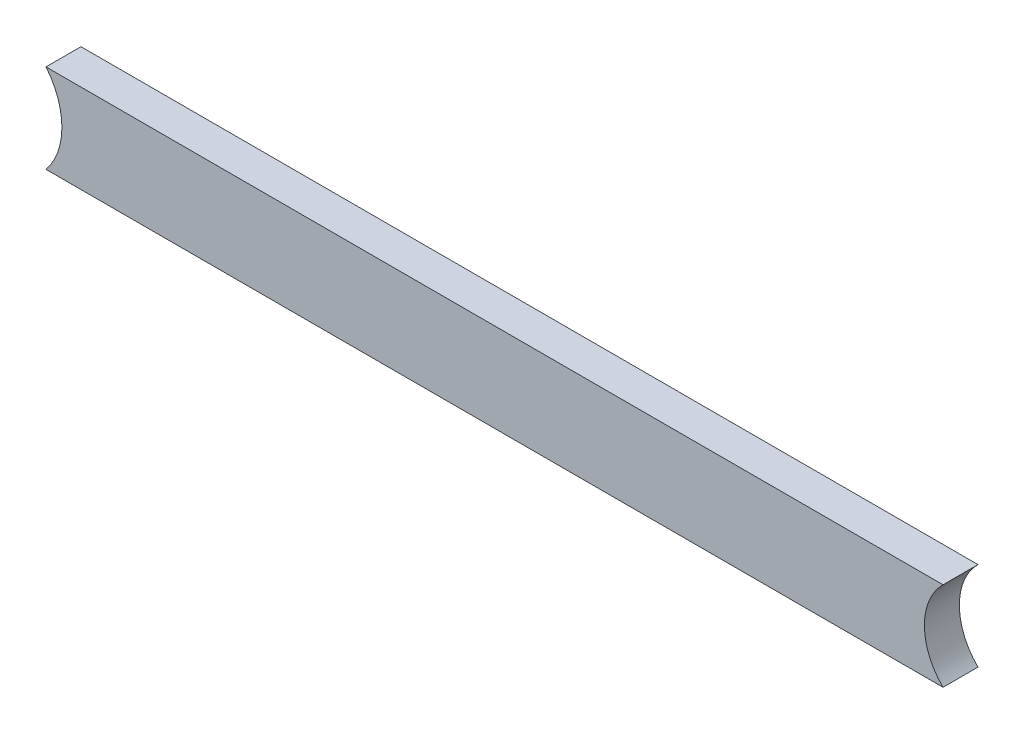
ISO-10303-21;
HEADER;
FILE_DESCRIPTION(('STEP AP214'),'2;1');
FILE_NAME('part.step','',(''),(''),'','','');
FILE_SCHEMA(('AUTOMOTIVE_DESIGN { 1 0 10303 214 1 1 1 1 }'));
ENDSEC;
DATA;
#1=APPLICATION_CONTEXT('core data for automotive mechanical design processes');
#2=APPLICATION_PROTOCOL_DEFINITION('international standard','automotive_design',2000,#1);
#3=PRODUCT_CONTEXT('',#1,'mechanical');
#4=PRODUCT('Part','Part','',(#3));
#5=PRODUCT_RELATED_PRODUCT_CATEGORY('part','',(#4));
#6=PRODUCT_DEFINITION_FORMATION('','',#4);
#7=PRODUCT_DEFINITION_CONTEXT('part definition',#1,'design');
#8=PRODUCT_DEFINITION('design','',#6,#7);
#9=PRODUCT_DEFINITION_SHAPE('','',#8);
#10=(LENGTH_UNIT() NAMED_UNIT(*) SI_UNIT(.MILLI.,.METRE.));
#11=(NAMED_UNIT(*) PLANE_ANGLE_UNIT() SI_UNIT($,.RADIAN.));
#12=(NAMED_UNIT(*) SI_UNIT($,.STERADIAN.) SOLID_ANGLE_UNIT());
#13=UNCERTAINTY_MEASURE_WITH_UNIT(LENGTH_MEASURE(1.E-05),#10,'distance_accuracy_value','');
#14=(GEOMETRIC_REPRESENTATION_CONTEXT(3) GLOBAL_UNCERTAINTY_ASSIGNED_CONTEXT((#13)) GLOBAL_UNIT_ASSIGNED_CONTEXT((#10,
#11,#12)) REPRESENTATION_CONTEXT('',''));
#15=CARTESIAN_POINT('',(0.,0.,0.));
#16=DIRECTION('',(0.,0.,1.));
#17=DIRECTION('',(1.,0.,0.));
#18=AXIS2_PLACEMENT_3D('',#15,#16,#17);
#19=CARTESIAN_POINT('',(112.831003818748,70.104,0.));
#20=DIRECTION('',(0.,1.,0.));
#21=DIRECTION('',(1.,0.,0.));
#22=AXIS2_PLACEMENT_3D('',#19,#20,#21);
#23=PLANE('',#22);
#24=DIRECTION('',(1.,0.,0.));
#25=VECTOR('',#24,1.);
#26=CARTESIAN_POINT('',(112.522,70.104,0.1999996));
#27=LINE('',#26,#25);
#28=CARTESIAN_POINT('',(112.831003818748,70.104,0.1999996));
#29=VERTEX_POINT('',#28);
#30=CARTESIAN_POINT('',(117.962731842133,70.104,0.1999996));
#31=VERTEX_POINT('',#30);
#32=EDGE_CURVE('E11',#29,#31,#27,.T.);
#33=ORIENTED_EDGE('',*,*,#32,.F.);
#34=DIRECTION('',(0.,0.,1.));
#35=VECTOR('',#34,1.);
#36=CARTESIAN_POINT('',(112.831003818748,70.104,0.));
#37=LINE('',#36,#35);
#38=CARTESIAN_POINT('',(112.831003818748,70.104,0.));
#39=VERTEX_POINT('',#38);
#40=EDGE_CURVE('E24',#39,#29,#37,.T.);
#41=ORIENTED_EDGE('',*,*,#40,.F.);
#42=DIRECTION('',(1.,0.,0.));
#43=VECTOR('',#42,1.);
#44=CARTESIAN_POINT('',(112.522,70.104,0.));
#45=LINE('',#44,#43);
#46=CARTESIAN_POINT('',(117.962731842133,70.104,0.));
#47=VERTEX_POINT('',#46);
#48=EDGE_CURVE('E82',#39,#47,#45,.T.);
#49=ORIENTED_EDGE('',*,*,#48,.T.);
#50=DIRECTION('',(0.,0.,1.));
#51=VECTOR('',#50,1.);
#52=CARTESIAN_POINT('',(117.962731842133,70.104,0.));
#53=LINE('',#52,#51);
#54=EDGE_CURVE('E37',#47,#31,#53,.T.);
#55=ORIENTED_EDGE('',*,*,#54,.T.);
#56=EDGE_LOOP('',(#33,#41,#49,#55));
#57=FACE_BOUND('',#56,.T.);
#58=ADVANCED_FACE('F17',(#57),#23,.F.);
#59=CARTESIAN_POINT('',(118.2116,70.358,0.));
#60=DIRECTION('',(0.,0.,-1.));
#61=DIRECTION('',(1.,0.,0.));
#62=AXIS2_PLACEMENT_3D('',#59,#60,#61);
#63=CYLINDRICAL_SURFACE('',#62,0.3556);
#64=DIRECTION('',(0.,0.,1.));
#65=VECTOR('',#64,1.);
#66=CARTESIAN_POINT('',(117.962731842133,70.612,0.));
#67=LINE('',#66,#65);
#68=CARTESIAN_POINT('',(117.962731842133,70.612,0.));
#69=VERTEX_POINT('',#68);
#70=CARTESIAN_POINT('',(117.962731842133,70.612,0.1999996));
#71=VERTEX_POINT('',#70);
#72=EDGE_CURVE('E97',#69,#71,#67,.T.);
#73=ORIENTED_EDGE('',*,*,#72,.T.);
#74=CARTESIAN_POINT('',(118.2116,70.358,0.1999996));
#75=DIRECTION('',(0.,0.,1.));
#76=DIRECTION('',(1.,0.,0.));
#77=AXIS2_PLACEMENT_3D('',#74,#75,#76);
#78=CIRCLE('',#77,0.3556);
#79=EDGE_CURVE('E94',#71,#31,#78,.T.);
#80=ORIENTED_EDGE('',*,*,#79,.T.);
#81=ORIENTED_EDGE('',*,*,#54,.F.);
#82=CARTESIAN_POINT('',(118.2116,70.358,0.));
#83=DIRECTION('',(0.,0.,1.));
#84=DIRECTION('',(1.,0.,0.));
#85=AXIS2_PLACEMENT_3D('',#82,#83,#84);
#86=CIRCLE('',#85,0.3556);
#87=EDGE_CURVE('E92',#69,#47,#86,.T.);
#88=ORIENTED_EDGE('',*,*,#87,.F.);
#89=EDGE_LOOP('',(#73,#80,#81,#88));
#90=FACE_BOUND('',#89,.T.);
#91=ADVANCED_FACE('F102',(#90),#63,.F.);
#92=CARTESIAN_POINT('',(117.962731842133,70.612,0.));
#93=DIRECTION('',(0.,-1.,0.));
#94=DIRECTION('',(-1.,0.,0.));
#95=AXIS2_PLACEMENT_3D('',#92,#93,#94);
#96=PLANE('',#95);
#97=DIRECTION('',(-1.,0.,0.));
#98=VECTOR('',#97,1.);
#99=CARTESIAN_POINT('',(118.2116,70.612,0.1999996));
#100=LINE('',#99,#98);
#101=CARTESIAN_POINT('',(112.831003818748,70.612,0.1999996));
#102=VERTEX_POINT('',#101);
#103=EDGE_CURVE('E89',#71,#102,#100,.T.);
#104=ORIENTED_EDGE('',*,*,#103,.F.);
#105=ORIENTED_EDGE('',*,*,#72,.F.);
#106=DIRECTION('',(-1.,0.,0.));
#107=VECTOR('',#106,1.);
#108=CARTESIAN_POINT('',(118.2116,70.612,0.));
#109=LINE('',#108,#107);
#110=CARTESIAN_POINT('',(112.831003818748,70.612,0.));
#111=VERTEX_POINT('',#110);
#112=EDGE_CURVE('E87',#69,#111,#109,.T.);
#113=ORIENTED_EDGE('',*,*,#112,.T.);
#114=DIRECTION('',(0.,0.,1.));
#115=VECTOR('',#114,1.);
#116=CARTESIAN_POINT('',(112.831003818748,70.612,0.));
#117=LINE('',#116,#115);
#118=EDGE_CURVE('E69',#111,#102,#117,.T.);
#119=ORIENTED_EDGE('',*,*,#118,.T.);
#120=EDGE_LOOP('',(#104,#105,#113,#119));
#121=FACE_BOUND('',#120,.T.);
#122=ADVANCED_FACE('F108',(#121),#96,.F.);
#123=CARTESIAN_POINT('',(112.522,70.358,0.));
#124=DIRECTION('',(0.,0.,-1.));
#125=DIRECTION('',(1.,0.,0.));
#126=AXIS2_PLACEMENT_3D('',#123,#124,#125);
#127=CYLINDRICAL_SURFACE('',#126,0.3999992);
#128=DIRECTION('',(0.,0.,1.));
#129=VECTOR('',#128,1.);
#130=CARTESIAN_POINT('',(112.9219992,70.358,0.));
#131=LINE('',#130,#129);
#132=CARTESIAN_POINT('',(112.9219992,70.358,0.));
#133=VERTEX_POINT('',#132);
#134=CARTESIAN_POINT('',(112.9219992,70.358,0.1999996));
#135=VERTEX_POINT('',#134);
#136=EDGE_CURVE('E59',#133,#135,#131,.T.);
#137=ORIENTED_EDGE('',*,*,#136,.T.);
#138=CARTESIAN_POINT('',(112.522,70.358,0.1999996));
#139=DIRECTION('',(0.,0.,1.));
#140=DIRECTION('',(1.,0.,0.));
#141=AXIS2_PLACEMENT_3D('',#138,#139,#140);
#142=CIRCLE('',#141,0.3999992);
#143=EDGE_CURVE('E70',#135,#102,#142,.T.);
#144=ORIENTED_EDGE('',*,*,#143,.T.);
#145=ORIENTED_EDGE('',*,*,#118,.F.);
#146=CARTESIAN_POINT('',(112.522,70.358,0.));
#147=DIRECTION('',(0.,0.,1.));
#148=DIRECTION('',(1.,0.,0.));
#149=AXIS2_PLACEMENT_3D('',#146,#147,#148);
#150=CIRCLE('',#149,0.3999992);
#151=EDGE_CURVE('E73',#133,#111,#150,.T.);
#152=ORIENTED_EDGE('',*,*,#151,.F.);
#153=EDGE_LOOP('',(#137,#144,#145,#152));
#154=FACE_BOUND('',#153,.T.);
#155=ADVANCED_FACE('F74',(#154),#127,.F.);
#156=CARTESIAN_POINT('',(112.522,70.358,0.));
#157=DIRECTION('',(0.,0.,-1.));
#158=DIRECTION('',(1.,0.,0.));
#159=AXIS2_PLACEMENT_3D('',#156,#157,#158);
#160=CYLINDRICAL_SURFACE('',#159,0.3999992);
#161=ORIENTED_EDGE('',*,*,#40,.T.);
#162=CARTESIAN_POINT('',(112.522,70.358,0.1999996));
#163=DIRECTION('',(0.,0.,1.));
#164=DIRECTION('',(1.,0.,0.));
#165=AXIS2_PLACEMENT_3D('',#162,#163,#164);
#166=CIRCLE('',#165,0.3999992);
#167=EDGE_CURVE('E65',#29,#135,#166,.T.);
#168=ORIENTED_EDGE('',*,*,#167,.T.);
#169=ORIENTED_EDGE('',*,*,#136,.F.);
#170=EDGE_CURVE('E63',#39,#133,#150,.T.);
#171=ORIENTED_EDGE('',*,*,#170,.F.);
#172=EDGE_LOOP('',(#161,#168,#169,#171));
#173=FACE_BOUND('',#172,.T.);
#174=ADVANCED_FACE('F61',(#173),#160,.F.);
#175=CARTESIAN_POINT('',(112.522,70.104,0.));
#176=DIRECTION('',(0.,0.,-1.));
#177=DIRECTION('',(-1.,0.,0.));
#178=AXIS2_PLACEMENT_3D('',#175,#176,#177);
#179=PLANE('',#178);
#180=ORIENTED_EDGE('',*,*,#48,.F.);
#181=ORIENTED_EDGE('',*,*,#170,.T.);
#182=ORIENTED_EDGE('',*,*,#151,.T.);
#183=ORIENTED_EDGE('',*,*,#112,.F.);
#184=ORIENTED_EDGE('',*,*,#87,.T.);
#185=EDGE_LOOP('',(#180,#181,#182,#183,#184));
#186=FACE_BOUND('',#185,.T.);
#187=ADVANCED_FACE('F80',(#186),#179,.T.);
#188=CARTESIAN_POINT('',(112.522,70.104,0.1999996));
#189=DIRECTION('',(0.,0.,-1.));
#190=DIRECTION('',(-1.,0.,0.));
#191=AXIS2_PLACEMENT_3D('',#188,#189,#190);
#192=PLANE('',#191);
#193=ORIENTED_EDGE('',*,*,#167,.F.);
#194=ORIENTED_EDGE('',*,*,#32,.T.);
#195=ORIENTED_EDGE('',*,*,#79,.F.);
#196=ORIENTED_EDGE('',*,*,#103,.T.);
#197=ORIENTED_EDGE('',*,*,#143,.F.);
#198=EDGE_LOOP('',(#193,#194,#195,#196,#197));
#199=FACE_BOUND('',#198,.T.);
#200=ADVANCED_FACE('F106',(#199),#192,.F.);
#201=CLOSED_SHELL('',(#58,#91,#122,#155,#174,#187,#200));
#202=MANIFOLD_SOLID_BREP('B1',#201);
#203=ADVANCED_BREP_SHAPE_REPRESENTATION('',(#18,#202),#14);
#204=SHAPE_DEFINITION_REPRESENTATION(#9,#203);
ENDSEC;
END-ISO-10303-21;
